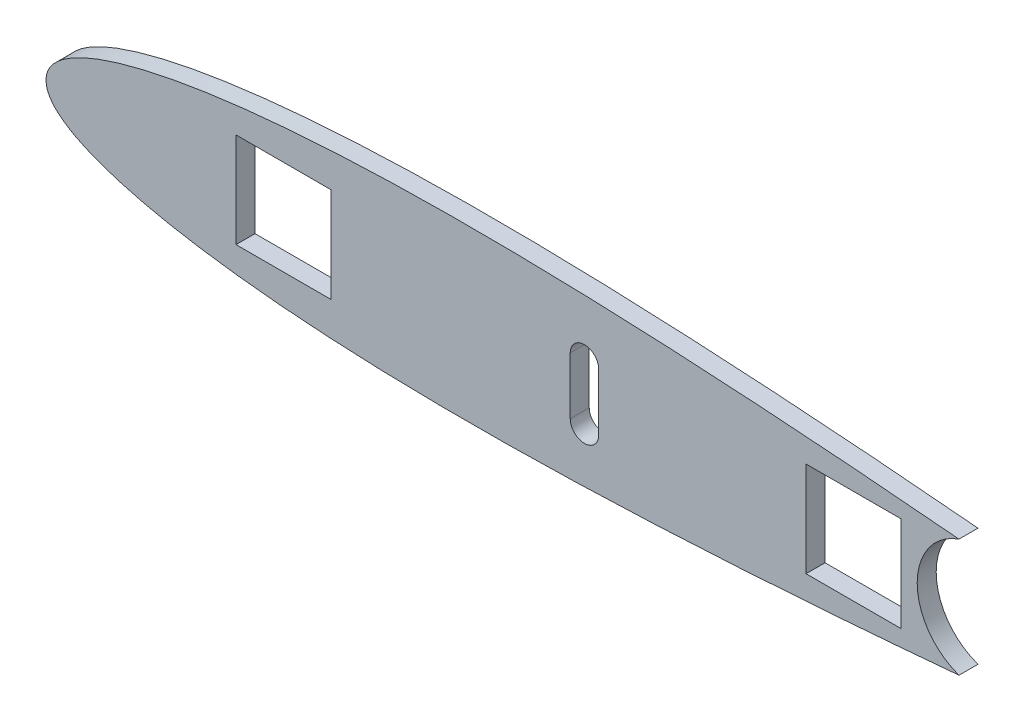
ISO-10303-21;
HEADER;
FILE_DESCRIPTION(('STEP AP214'),'2;1');
FILE_NAME('part.step','',(''),(''),'','','');
FILE_SCHEMA(('AUTOMOTIVE_DESIGN { 1 0 10303 214 1 1 1 1 }'));
ENDSEC;
DATA;
#1=APPLICATION_CONTEXT('core data for automotive mechanical design processes');
#2=APPLICATION_PROTOCOL_DEFINITION('international standard','automotive_design',2000,#1);
#3=PRODUCT_CONTEXT('',#1,'mechanical');
#4=PRODUCT('Part','Part','',(#3));
#5=PRODUCT_RELATED_PRODUCT_CATEGORY('part','',(#4));
#6=PRODUCT_DEFINITION_FORMATION('','',#4);
#7=PRODUCT_DEFINITION_CONTEXT('part definition',#1,'design');
#8=PRODUCT_DEFINITION('design','',#6,#7);
#9=PRODUCT_DEFINITION_SHAPE('','',#8);
#10=(LENGTH_UNIT() NAMED_UNIT(*) SI_UNIT(.MILLI.,.METRE.));
#11=(NAMED_UNIT(*) PLANE_ANGLE_UNIT() SI_UNIT($,.RADIAN.));
#12=(NAMED_UNIT(*) SI_UNIT($,.STERADIAN.) SOLID_ANGLE_UNIT());
#13=UNCERTAINTY_MEASURE_WITH_UNIT(LENGTH_MEASURE(1.E-05),#10,'distance_accuracy_value','');
#14=(GEOMETRIC_REPRESENTATION_CONTEXT(3) GLOBAL_UNCERTAINTY_ASSIGNED_CONTEXT((#13)) GLOBAL_UNIT_ASSIGNED_CONTEXT((#10,
#11,#12)) REPRESENTATION_CONTEXT('',''));
#15=CARTESIAN_POINT('',(0.,0.,0.));
#16=DIRECTION('',(0.,0.,1.));
#17=DIRECTION('',(1.,0.,0.));
#18=AXIS2_PLACEMENT_3D('',#15,#16,#17);
#19=CARTESIAN_POINT('',(98.2727801316517,0.,-0.01));
#20=DIRECTION('',(0.,0.,1.));
#21=DIRECTION('',(1.,0.,0.));
#22=AXIS2_PLACEMENT_3D('',#19,#20,#21);
#23=CYLINDRICAL_SURFACE('',#22,6.57367297916602);
#24=CARTESIAN_POINT('',(98.2727801316517,0.,0.));
#25=DIRECTION('',(0.,0.,-1.));
#26=DIRECTION('',(-1.,0.,0.));
#27=AXIS2_PLACEMENT_3D('',#24,#25,#26);
#28=CIRCLE('',#27,6.57367297916602);
#29=CARTESIAN_POINT('',(96.0984421911493,-6.20366270500869,0.));
#30=VERTEX_POINT('',#29);
#31=CARTESIAN_POINT('',(96.0984421911492,6.20366270500862,0.));
#32=VERTEX_POINT('',#31);
#33=EDGE_CURVE('E369',#30,#32,#28,.T.);
#34=ORIENTED_EDGE('',*,*,#33,.T.);
#35=DIRECTION('',(0.,0.,1.));
#36=VECTOR('',#35,1.);
#37=CARTESIAN_POINT('',(96.0984421911504,6.20366270500853,-0.01));
#38=LINE('',#37,#36);
#39=CARTESIAN_POINT('',(96.0984421911498,6.20366270500858,2.));
#40=VERTEX_POINT('',#39);
#41=EDGE_CURVE('E11',#32,#40,#38,.T.);
#42=ORIENTED_EDGE('',*,*,#41,.T.);
#43=CARTESIAN_POINT('',(98.2727801316517,0.,2.));
#44=DIRECTION('',(0.,0.,-1.));
#45=DIRECTION('',(-1.,0.,0.));
#46=AXIS2_PLACEMENT_3D('',#43,#44,#45);
#47=CIRCLE('',#46,6.57367297916602);
#48=CARTESIAN_POINT('',(96.0984421911499,-6.20366270500863,2.));
#49=VERTEX_POINT('',#48);
#50=EDGE_CURVE('E63',#49,#40,#47,.T.);
#51=ORIENTED_EDGE('',*,*,#50,.F.);
#52=DIRECTION('',(0.,0.,1.));
#53=VECTOR('',#52,1.);
#54=CARTESIAN_POINT('',(96.0984421911505,-6.20366270500858,-0.01));
#55=LINE('',#54,#53);
#56=EDGE_CURVE('E49',#49,#30,#55,.F.);
#57=ORIENTED_EDGE('',*,*,#56,.T.);
#58=EDGE_LOOP('',(#34,#42,#51,#57));
#59=FACE_BOUND('',#58,.T.);
#60=ADVANCED_FACE('F39',(#59),#23,.F.);
#61=CARTESIAN_POINT('',(150.,0.,2.));
#62=CARTESIAN_POINT('',(149.970810303824,0.00413247027790093,2.));
#63=CARTESIAN_POINT('',(149.505193272768,0.0700512290801424,2.));
#64=CARTESIAN_POINT('',(145.420848795191,0.644801769861765,2.));
#65=CARTESIAN_POINT('',(136.579140490007,1.82819578053143,2.));
#66=CARTESIAN_POINT('',(123.127907022393,3.46129711721265,2.));
#67=CARTESIAN_POINT('',(108.784193237312,5.01561269216374,2.));
#68=CARTESIAN_POINT('',(94.4750896656351,6.38138479152888,2.));
#69=CARTESIAN_POINT('',(80.384127490716,7.52487589483772,2.));
#70=CARTESIAN_POINT('',(67.2471798380362,8.34657326807912,2.));
#71=CARTESIAN_POINT('',(55.4492469291881,8.82398055942761,2.));
#72=CARTESIAN_POINT('',(45.268552865917,8.99448588106023,2.));
#73=CARTESIAN_POINT('',(36.6534461757634,8.88420481359412,2.));
#74=CARTESIAN_POINT('',(29.6103003795524,8.57335056911259,2.));
#75=CARTESIAN_POINT('',(24.0847382425465,8.16948510481198,2.));
#76=CARTESIAN_POINT('',(19.0332651731446,7.62778010369845,2.));
#77=CARTESIAN_POINT('',(14.502446862639,6.95545406859103,2.));
#78=CARTESIAN_POINT('',(11.0808665026298,6.27289235058471,2.));
#79=CARTESIAN_POINT('',(8.64096444597624,5.65840604873655,2.));
#80=CARTESIAN_POINT('',(7.03317259205418,5.18878374333255,2.));
#81=CARTESIAN_POINT('',(5.58341356907537,4.6951394099258,2.));
#82=CARTESIAN_POINT('',(4.29476246222922,4.17912910418133,2.));
#83=CARTESIAN_POINT('',(3.16984033745883,3.64229027011625,2.));
#84=CARTESIAN_POINT('',(2.21044072610041,3.085840760044,2.));
#85=CARTESIAN_POINT('',(1.41859373850265,2.51041162089755,2.));
#86=CARTESIAN_POINT('',(0.79351833530711,1.91545308538195,2.));
#87=CARTESIAN_POINT('',(0.343214491645345,1.29886256852423,2.));
#88=CARTESIAN_POINT('',(0.0541247272767373,0.657978530820046,2.));
#89=CARTESIAN_POINT('',(0.0177376787991794,0.215631790194129,2.));
#90=CARTESIAN_POINT('',(0.,0.,2.));
#91=B_SPLINE_CURVE_WITH_KNOTS('',3,(#61,#62,#63,#64,#65,#66,#67,#68,#69,#70,#71,#72,#73,#74,#75,
#76,#77,#78,#79,#80,#81,#82,#83,#84,#85,#86,#87,#88,#89,#90),.UNSPECIFIED.,.F.,.F.,(4,1,1,1,1,1,
1,1,1,1,1,1,1,1,1,1,1,1,1,1,1,1,1,1,1,1,1,4),(0.,0.000578292024416172,0.00922457753142214,
0.0809074610448807,0.175560184178891,0.275014621448024,0.363913352303674,0.457515973042139,
0.552321462271905,0.622093917460096,0.689118854407299,0.752035265470937,0.791075641535419,
0.827397593084318,0.860698922249128,0.890714332661563,0.917222970830825,0.929108018611283,
0.940059875071259,0.950070168420696,0.95913835717605,0.967273831549158,0.974500443960092,
0.980862985696458,0.986437693887403,0.991348140987964,0.995782458248403,1.),.UNSPECIFIED.);
#92=DIRECTION('',(0.,0.,-1.));
#93=VECTOR('',#92,1.);
#94=SURFACE_OF_LINEAR_EXTRUSION('',#91,#93);
#95=ORIENTED_EDGE('',*,*,#41,.F.);
#96=CARTESIAN_POINT('',(150.,0.,0.));
#97=CARTESIAN_POINT('',(149.970810303824,0.00413247027790093,0.));
#98=CARTESIAN_POINT('',(149.505193272768,0.0700512290801424,0.));
#99=CARTESIAN_POINT('',(145.420848795191,0.644801769861765,0.));
#100=CARTESIAN_POINT('',(136.579140490007,1.82819578053143,0.));
#101=CARTESIAN_POINT('',(123.127907022393,3.46129711721265,0.));
#102=CARTESIAN_POINT('',(108.784193237312,5.01561269216374,0.));
#103=CARTESIAN_POINT('',(94.4750896656351,6.38138479152888,0.));
#104=CARTESIAN_POINT('',(80.384127490716,7.52487589483772,0.));
#105=CARTESIAN_POINT('',(67.2471798380362,8.34657326807912,0.));
#106=CARTESIAN_POINT('',(55.4492469291881,8.82398055942761,0.));
#107=CARTESIAN_POINT('',(45.268552865917,8.99448588106023,0.));
#108=CARTESIAN_POINT('',(36.6534461757634,8.88420481359412,0.));
#109=CARTESIAN_POINT('',(29.6103003795524,8.57335056911259,0.));
#110=CARTESIAN_POINT('',(24.0847382425465,8.16948510481198,0.));
#111=CARTESIAN_POINT('',(19.0332651731446,7.62778010369845,0.));
#112=CARTESIAN_POINT('',(14.502446862639,6.95545406859103,0.));
#113=CARTESIAN_POINT('',(11.0808665026298,6.27289235058471,0.));
#114=CARTESIAN_POINT('',(8.64096444597624,5.65840604873655,0.));
#115=CARTESIAN_POINT('',(7.03317259205418,5.18878374333255,0.));
#116=CARTESIAN_POINT('',(5.58341356907537,4.6951394099258,0.));
#117=CARTESIAN_POINT('',(4.29476246222922,4.17912910418133,0.));
#118=CARTESIAN_POINT('',(3.16984033745883,3.64229027011625,0.));
#119=CARTESIAN_POINT('',(2.21044072610041,3.085840760044,0.));
#120=CARTESIAN_POINT('',(1.41859373850265,2.51041162089755,0.));
#121=CARTESIAN_POINT('',(0.79351833530711,1.91545308538195,0.));
#122=CARTESIAN_POINT('',(0.343214491645345,1.29886256852423,0.));
#123=CARTESIAN_POINT('',(0.0541247272767373,0.657978530820046,0.));
#124=CARTESIAN_POINT('',(0.0177376787991794,0.215631790194129,0.));
#125=CARTESIAN_POINT('',(0.,0.,0.));
#126=B_SPLINE_CURVE_WITH_KNOTS('',3,(#96,#97,#98,#99,#100,#101,#102,#103,#104,#105,#106,#107,
#108,#109,#110,#111,#112,#113,#114,#115,#116,#117,#118,#119,#120,#121,#122,#123,#124,#125),
.UNSPECIFIED.,.F.,.F.,(4,1,1,1,1,1,1,1,1,1,1,1,1,1,1,1,1,1,1,1,1,1,1,1,1,1,1,4),(0.,
0.000578292024416172,0.00922457753142214,0.0809074610448807,0.175560184178891,0.275014621448024,
0.363913352303674,0.457515973042139,0.552321462271905,0.622093917460096,0.689118854407299,
0.752035265470937,0.791075641535419,0.827397593084318,0.860698922249128,0.890714332661563,
0.917222970830825,0.929108018611283,0.940059875071259,0.950070168420696,0.95913835717605,
0.967273831549158,0.974500443960092,0.980862985696458,0.986437693887403,0.991348140987964,
0.995782458248403,1.),.UNSPECIFIED.);
#127=CARTESIAN_POINT('',(0.,0.,0.));
#128=VERTEX_POINT('',#127);
#129=EDGE_CURVE('E298',#32,#128,#126,.T.);
#130=ORIENTED_EDGE('',*,*,#129,.T.);
#131=DIRECTION('',(0.,0.,-1.));
#132=VECTOR('',#131,1.);
#133=CARTESIAN_POINT('',(0.,0.,2.));
#134=LINE('',#133,#132);
#135=CARTESIAN_POINT('',(0.,0.,2.));
#136=VERTEX_POINT('',#135);
#137=EDGE_CURVE('E382',#136,#128,#134,.T.);
#138=ORIENTED_EDGE('',*,*,#137,.F.);
#139=EDGE_CURVE('E297',#40,#136,#91,.T.);
#140=ORIENTED_EDGE('',*,*,#139,.F.);
#141=EDGE_LOOP('',(#95,#130,#138,#140));
#142=FACE_BOUND('',#141,.T.);
#143=ADVANCED_FACE('F309',(#142),#94,.F.);
#144=CARTESIAN_POINT('',(0.,0.,2.));
#145=CARTESIAN_POINT('',(0.0177376787991794,-0.215631790194129,2.));
#146=CARTESIAN_POINT('',(0.0541247272767369,-0.657978530820046,2.));
#147=CARTESIAN_POINT('',(0.343214491645348,-1.29886256852425,2.));
#148=CARTESIAN_POINT('',(0.793518335307111,-1.91545308538195,2.));
#149=CARTESIAN_POINT('',(1.41859373850264,-2.51041162089754,2.));
#150=CARTESIAN_POINT('',(2.21044072610041,-3.085840760044,2.));
#151=CARTESIAN_POINT('',(3.16984033745882,-3.64229027011627,2.));
#152=CARTESIAN_POINT('',(4.29476246222924,-4.17912910418133,2.));
#153=CARTESIAN_POINT('',(5.58341356907541,-4.6951394099258,2.));
#154=CARTESIAN_POINT('',(7.03317259205414,-5.18878374333255,2.));
#155=CARTESIAN_POINT('',(8.64096444597628,-5.65840604873651,2.));
#156=CARTESIAN_POINT('',(11.0808665026297,-6.27289235058471,2.));
#157=CARTESIAN_POINT('',(14.5024468626391,-6.95545406859103,2.));
#158=CARTESIAN_POINT('',(19.0332651731447,-7.62778010369857,2.));
#159=CARTESIAN_POINT('',(24.0847382425464,-8.16948510481198,2.));
#160=CARTESIAN_POINT('',(29.6103003795524,-8.57335056911259,2.));
#161=CARTESIAN_POINT('',(36.6534461757636,-8.88420481359409,2.));
#162=CARTESIAN_POINT('',(45.2685528659167,-8.99448588106023,2.));
#163=CARTESIAN_POINT('',(55.4492469291882,-8.82398055942765,2.));
#164=CARTESIAN_POINT('',(67.2471798380359,-8.34657326807916,2.));
#165=CARTESIAN_POINT('',(80.3841274907154,-7.52487589483776,2.));
#166=CARTESIAN_POINT('',(94.4750896656351,-6.38138479152894,2.));
#167=CARTESIAN_POINT('',(108.784193237314,-5.01561269216372,2.));
#168=CARTESIAN_POINT('',(123.127907022394,-3.46129711721264,2.));
#169=CARTESIAN_POINT('',(136.579140490007,-1.82819578053142,2.));
#170=CARTESIAN_POINT('',(145.420848795191,-0.644801769861778,2.));
#171=CARTESIAN_POINT('',(149.505193272768,-0.0700512290801454,2.));
#172=CARTESIAN_POINT('',(149.970810303824,-0.00413247027789827,2.));
#173=CARTESIAN_POINT('',(150.,0.,2.));
#174=B_SPLINE_CURVE_WITH_KNOTS('',3,(#144,#145,#146,#147,#148,#149,#150,#151,#152,#153,#154,
#155,#156,#157,#158,#159,#160,#161,#162,#163,#164,#165,#166,#167,#168,#169,#170,#171,#172,#173),
.UNSPECIFIED.,.F.,.F.,(4,1,1,1,1,1,1,1,1,1,1,1,1,1,1,1,1,1,1,1,1,1,1,1,1,1,1,4),(0.,
0.00421754175159676,0.00865185901203598,0.013562306112597,0.0191370143035422,0.0254995560399083,
0.0327261684508418,0.0408616428239496,0.049929831579304,0.0599401249287409,0.0708919813887169,
0.082777029169175,0.109285667338437,0.139301077750872,0.172602406915682,0.208924358464581,
0.247964734529063,0.310881145592701,0.377906082539904,0.447678537728095,0.542484026957861,
0.636086647696326,0.724985378551976,0.824439815821109,0.919092538955119,0.990775422468578,
0.999421707975584,1.),.UNSPECIFIED.);
#175=DIRECTION('',(0.,0.,-1.));
#176=VECTOR('',#175,1.);
#177=SURFACE_OF_LINEAR_EXTRUSION('',#174,#176);
#178=ORIENTED_EDGE('',*,*,#56,.F.);
#179=EDGE_CURVE('E291',#136,#49,#174,.T.);
#180=ORIENTED_EDGE('',*,*,#179,.F.);
#181=ORIENTED_EDGE('',*,*,#137,.T.);
#182=CARTESIAN_POINT('',(0.,0.,0.));
#183=CARTESIAN_POINT('',(0.0177376787991794,-0.215631790194129,0.));
#184=CARTESIAN_POINT('',(0.0541247272767369,-0.657978530820046,0.));
#185=CARTESIAN_POINT('',(0.343214491645348,-1.29886256852425,0.));
#186=CARTESIAN_POINT('',(0.793518335307111,-1.91545308538195,0.));
#187=CARTESIAN_POINT('',(1.41859373850264,-2.51041162089754,0.));
#188=CARTESIAN_POINT('',(2.21044072610041,-3.085840760044,0.));
#189=CARTESIAN_POINT('',(3.16984033745882,-3.64229027011627,0.));
#190=CARTESIAN_POINT('',(4.29476246222924,-4.17912910418133,0.));
#191=CARTESIAN_POINT('',(5.58341356907541,-4.6951394099258,0.));
#192=CARTESIAN_POINT('',(7.03317259205414,-5.18878374333255,0.));
#193=CARTESIAN_POINT('',(8.64096444597628,-5.65840604873651,0.));
#194=CARTESIAN_POINT('',(11.0808665026297,-6.27289235058471,0.));
#195=CARTESIAN_POINT('',(14.5024468626391,-6.95545406859103,0.));
#196=CARTESIAN_POINT('',(19.0332651731447,-7.62778010369857,0.));
#197=CARTESIAN_POINT('',(24.0847382425464,-8.16948510481198,0.));
#198=CARTESIAN_POINT('',(29.6103003795524,-8.57335056911259,0.));
#199=CARTESIAN_POINT('',(36.6534461757636,-8.88420481359409,0.));
#200=CARTESIAN_POINT('',(45.2685528659167,-8.99448588106023,0.));
#201=CARTESIAN_POINT('',(55.4492469291882,-8.82398055942765,0.));
#202=CARTESIAN_POINT('',(67.2471798380359,-8.34657326807916,0.));
#203=CARTESIAN_POINT('',(80.3841274907154,-7.52487589483776,0.));
#204=CARTESIAN_POINT('',(94.4750896656351,-6.38138479152894,0.));
#205=CARTESIAN_POINT('',(108.784193237314,-5.01561269216372,0.));
#206=CARTESIAN_POINT('',(123.127907022394,-3.46129711721264,0.));
#207=CARTESIAN_POINT('',(136.579140490007,-1.82819578053142,0.));
#208=CARTESIAN_POINT('',(145.420848795191,-0.644801769861778,0.));
#209=CARTESIAN_POINT('',(149.505193272768,-0.0700512290801454,0.));
#210=CARTESIAN_POINT('',(149.970810303824,-0.00413247027789827,0.));
#211=CARTESIAN_POINT('',(150.,0.,0.));
#212=B_SPLINE_CURVE_WITH_KNOTS('',3,(#182,#183,#184,#185,#186,#187,#188,#189,#190,#191,#192,
#193,#194,#195,#196,#197,#198,#199,#200,#201,#202,#203,#204,#205,#206,#207,#208,#209,#210,#211),
.UNSPECIFIED.,.F.,.F.,(4,1,1,1,1,1,1,1,1,1,1,1,1,1,1,1,1,1,1,1,1,1,1,1,1,1,1,4),(0.,
0.00421754175159676,0.00865185901203598,0.013562306112597,0.0191370143035422,0.0254995560399083,
0.0327261684508418,0.0408616428239496,0.049929831579304,0.0599401249287409,0.0708919813887169,
0.082777029169175,0.109285667338437,0.139301077750872,0.172602406915682,0.208924358464581,
0.247964734529063,0.310881145592701,0.377906082539904,0.447678537728095,0.542484026957861,
0.636086647696326,0.724985378551976,0.824439815821109,0.919092538955119,0.990775422468578,
0.999421707975584,1.),.UNSPECIFIED.);
#213=EDGE_CURVE('E42',#128,#30,#212,.T.);
#214=ORIENTED_EDGE('',*,*,#213,.T.);
#215=EDGE_LOOP('',(#178,#180,#181,#214));
#216=FACE_BOUND('',#215,.T.);
#217=ADVANCED_FACE('F305',(#216),#177,.F.);
#218=CARTESIAN_POINT('',(73.959377623778,-7.91362684741891,2.));
#219=DIRECTION('',(0.,0.,-1.));
#220=DIRECTION('',(-1.,0.,0.));
#221=AXIS2_PLACEMENT_3D('',#218,#219,#220);
#222=PLANE('',#221);
#223=DIRECTION('',(0.,1.,0.));
#224=VECTOR('',#223,1.);
#225=CARTESIAN_POINT('',(58.1780561277094,-3.27924130211344,2.));
#226=LINE('',#225,#224);
#227=CARTESIAN_POINT('',(58.1780561277094,-3.27924130211344,2.));
#228=VERTEX_POINT('',#227);
#229=CARTESIAN_POINT('',(58.1780561277094,2.72116263132885,2.));
#230=VERTEX_POINT('',#229);
#231=EDGE_CURVE('E189',#228,#230,#226,.T.);
#232=ORIENTED_EDGE('',*,*,#231,.F.);
#233=CARTESIAN_POINT('',(56.6779551443489,-3.27924130211344,2.));
#234=DIRECTION('',(0.,0.,1.));
#235=DIRECTION('',(1.,0.,0.));
#236=AXIS2_PLACEMENT_3D('',#233,#234,#235);
#237=CIRCLE('',#236,1.50010098336057);
#238=CARTESIAN_POINT('',(55.1778541609883,-3.27924130211344,2.));
#239=VERTEX_POINT('',#238);
#240=EDGE_CURVE('E155',#239,#228,#237,.T.);
#241=ORIENTED_EDGE('',*,*,#240,.F.);
#242=DIRECTION('',(0.,-1.,0.));
#243=VECTOR('',#242,1.);
#244=CARTESIAN_POINT('',(55.1778541609883,-3.27924130211344,2.));
#245=LINE('',#244,#243);
#246=CARTESIAN_POINT('',(55.1778541609883,2.72116263132885,2.));
#247=VERTEX_POINT('',#246);
#248=EDGE_CURVE('E176',#247,#239,#245,.T.);
#249=ORIENTED_EDGE('',*,*,#248,.F.);
#250=CARTESIAN_POINT('',(56.6779551443489,2.72116263132885,2.));
#251=DIRECTION('',(0.,0.,1.));
#252=DIRECTION('',(1.,0.,0.));
#253=AXIS2_PLACEMENT_3D('',#250,#251,#252);
#254=CIRCLE('',#253,1.50010098336057);
#255=EDGE_CURVE('E180',#230,#247,#254,.T.);
#256=ORIENTED_EDGE('',*,*,#255,.F.);
#257=EDGE_LOOP('',(#232,#241,#249,#256));
#258=FACE_BOUND('',#257,.T.);
#259=DIRECTION('',(1.,0.,0.));
#260=VECTOR('',#259,1.);
#261=CARTESIAN_POINT('',(20.,5.,2.));
#262=LINE('',#261,#260);
#263=CARTESIAN_POINT('',(20.,5.,2.));
#264=VERTEX_POINT('',#263);
#265=CARTESIAN_POINT('',(30.,5.,2.));
#266=VERTEX_POINT('',#265);
#267=EDGE_CURVE('E225',#264,#266,#262,.T.);
#268=ORIENTED_EDGE('',*,*,#267,.T.);
#269=DIRECTION('',(0.,-1.,0.));
#270=VECTOR('',#269,1.);
#271=CARTESIAN_POINT('',(30.,5.,2.));
#272=LINE('',#271,#270);
#273=CARTESIAN_POINT('',(30.,-5.,2.));
#274=VERTEX_POINT('',#273);
#275=EDGE_CURVE('E272',#266,#274,#272,.T.);
#276=ORIENTED_EDGE('',*,*,#275,.T.);
#277=DIRECTION('',(1.,0.,0.));
#278=VECTOR('',#277,1.);
#279=CARTESIAN_POINT('',(20.,-5.,2.));
#280=LINE('',#279,#278);
#281=CARTESIAN_POINT('',(20.,-5.,2.));
#282=VERTEX_POINT('',#281);
#283=EDGE_CURVE('E267',#282,#274,#280,.T.);
#284=ORIENTED_EDGE('',*,*,#283,.F.);
#285=DIRECTION('',(0.,-1.,0.));
#286=VECTOR('',#285,1.);
#287=CARTESIAN_POINT('',(20.,5.,2.));
#288=LINE('',#287,#286);
#289=EDGE_CURVE('E263',#264,#282,#288,.T.);
#290=ORIENTED_EDGE('',*,*,#289,.F.);
#291=EDGE_LOOP('',(#268,#276,#284,#290));
#292=FACE_BOUND('',#291,.T.);
#293=ORIENTED_EDGE('',*,*,#179,.T.);
#294=ORIENTED_EDGE('',*,*,#50,.T.);
#295=ORIENTED_EDGE('',*,*,#139,.T.);
#296=EDGE_LOOP('',(#293,#294,#295));
#297=FACE_BOUND('',#296,.T.);
#298=DIRECTION('',(1.,0.,0.));
#299=VECTOR('',#298,1.);
#300=CARTESIAN_POINT('',(80.,5.,2.));
#301=LINE('',#300,#299);
#302=CARTESIAN_POINT('',(80.,5.,2.));
#303=VERTEX_POINT('',#302);
#304=CARTESIAN_POINT('',(90.,5.,2.));
#305=VERTEX_POINT('',#304);
#306=EDGE_CURVE('E220',#303,#305,#301,.T.);
#307=ORIENTED_EDGE('',*,*,#306,.T.);
#308=DIRECTION('',(0.,-1.,0.));
#309=VECTOR('',#308,1.);
#310=CARTESIAN_POINT('',(90.,5.,2.));
#311=LINE('',#310,#309);
#312=CARTESIAN_POINT('',(90.,-4.99999999999999,2.));
#313=VERTEX_POINT('',#312);
#314=EDGE_CURVE('E224',#305,#313,#311,.T.);
#315=ORIENTED_EDGE('',*,*,#314,.T.);
#316=DIRECTION('',(1.,0.,0.));
#317=VECTOR('',#316,1.);
#318=CARTESIAN_POINT('',(80.,-4.99999999999999,2.));
#319=LINE('',#318,#317);
#320=CARTESIAN_POINT('',(80.,-4.99999999999999,2.));
#321=VERTEX_POINT('',#320);
#322=EDGE_CURVE('E229',#321,#313,#319,.T.);
#323=ORIENTED_EDGE('',*,*,#322,.F.);
#324=DIRECTION('',(0.,-1.,0.));
#325=VECTOR('',#324,1.);
#326=CARTESIAN_POINT('',(80.,5.,2.));
#327=LINE('',#326,#325);
#328=EDGE_CURVE('E208',#303,#321,#327,.T.);
#329=ORIENTED_EDGE('',*,*,#328,.F.);
#330=EDGE_LOOP('',(#307,#315,#323,#329));
#331=FACE_BOUND('',#330,.T.);
#332=ADVANCED_FACE('F308',(#258,#292,#297,#331),#222,.F.);
#333=CARTESIAN_POINT('',(73.959377623778,-7.91362684741891,0.));
#334=DIRECTION('',(0.,0.,-1.));
#335=DIRECTION('',(-1.,0.,0.));
#336=AXIS2_PLACEMENT_3D('',#333,#334,#335);
#337=PLANE('',#336);
#338=ORIENTED_EDGE('',*,*,#33,.F.);
#339=ORIENTED_EDGE('',*,*,#213,.F.);
#340=ORIENTED_EDGE('',*,*,#129,.F.);
#341=EDGE_LOOP('',(#338,#339,#340));
#342=FACE_BOUND('',#341,.T.);
#343=CARTESIAN_POINT('',(56.6779551443489,-3.27924130211344,0.));
#344=DIRECTION('',(0.,0.,1.));
#345=DIRECTION('',(1.,0.,0.));
#346=AXIS2_PLACEMENT_3D('',#343,#344,#345);
#347=CIRCLE('',#346,1.50010098336057);
#348=CARTESIAN_POINT('',(55.1778541609883,-3.27924130211344,0.));
#349=VERTEX_POINT('',#348);
#350=CARTESIAN_POINT('',(58.1780561277094,-3.27924130211344,0.));
#351=VERTEX_POINT('',#350);
#352=EDGE_CURVE('E152',#349,#351,#347,.T.);
#353=ORIENTED_EDGE('',*,*,#352,.T.);
#354=DIRECTION('',(0.,1.,0.));
#355=VECTOR('',#354,1.);
#356=CARTESIAN_POINT('',(58.1780561277094,-3.27924130211344,0.));
#357=LINE('',#356,#355);
#358=CARTESIAN_POINT('',(58.1780561277094,2.72116263132885,0.));
#359=VERTEX_POINT('',#358);
#360=EDGE_CURVE('E165',#351,#359,#357,.T.);
#361=ORIENTED_EDGE('',*,*,#360,.T.);
#362=CARTESIAN_POINT('',(56.6779551443489,2.72116263132885,0.));
#363=DIRECTION('',(0.,0.,1.));
#364=DIRECTION('',(1.,0.,0.));
#365=AXIS2_PLACEMENT_3D('',#362,#363,#364);
#366=CIRCLE('',#365,1.50010098336057);
#367=CARTESIAN_POINT('',(55.1778541609883,2.72116263132885,0.));
#368=VERTEX_POINT('',#367);
#369=EDGE_CURVE('E170',#359,#368,#366,.T.);
#370=ORIENTED_EDGE('',*,*,#369,.T.);
#371=DIRECTION('',(0.,-1.,0.));
#372=VECTOR('',#371,1.);
#373=CARTESIAN_POINT('',(55.1778541609883,-3.27924130211344,0.));
#374=LINE('',#373,#372);
#375=EDGE_CURVE('E161',#368,#349,#374,.T.);
#376=ORIENTED_EDGE('',*,*,#375,.T.);
#377=EDGE_LOOP('',(#353,#361,#370,#376));
#378=FACE_BOUND('',#377,.T.);
#379=DIRECTION('',(0.,-1.,0.));
#380=VECTOR('',#379,1.);
#381=CARTESIAN_POINT('',(30.,5.,0.));
#382=LINE('',#381,#380);
#383=CARTESIAN_POINT('',(30.,5.,0.));
#384=VERTEX_POINT('',#383);
#385=CARTESIAN_POINT('',(30.,-5.,0.));
#386=VERTEX_POINT('',#385);
#387=EDGE_CURVE('E286',#384,#386,#382,.T.);
#388=ORIENTED_EDGE('',*,*,#387,.F.);
#389=DIRECTION('',(1.,0.,0.));
#390=VECTOR('',#389,1.);
#391=CARTESIAN_POINT('',(20.,5.,0.));
#392=LINE('',#391,#390);
#393=CARTESIAN_POINT('',(20.,5.,0.));
#394=VERTEX_POINT('',#393);
#395=EDGE_CURVE('E268',#394,#384,#392,.T.);
#396=ORIENTED_EDGE('',*,*,#395,.F.);
#397=DIRECTION('',(0.,-1.,0.));
#398=VECTOR('',#397,1.);
#399=CARTESIAN_POINT('',(20.,5.,0.));
#400=LINE('',#399,#398);
#401=CARTESIAN_POINT('',(20.,-5.,0.));
#402=VERTEX_POINT('',#401);
#403=EDGE_CURVE('E262',#394,#402,#400,.T.);
#404=ORIENTED_EDGE('',*,*,#403,.T.);
#405=DIRECTION('',(1.,0.,0.));
#406=VECTOR('',#405,1.);
#407=CARTESIAN_POINT('',(20.,-5.,0.));
#408=LINE('',#407,#406);
#409=EDGE_CURVE('E282',#402,#386,#408,.T.);
#410=ORIENTED_EDGE('',*,*,#409,.T.);
#411=EDGE_LOOP('',(#388,#396,#404,#410));
#412=FACE_BOUND('',#411,.T.);
#413=DIRECTION('',(0.,-1.,0.));
#414=VECTOR('',#413,1.);
#415=CARTESIAN_POINT('',(90.,5.,0.));
#416=LINE('',#415,#414);
#417=CARTESIAN_POINT('',(90.,5.,0.));
#418=VERTEX_POINT('',#417);
#419=CARTESIAN_POINT('',(90.,-4.99999999999999,0.));
#420=VERTEX_POINT('',#419);
#421=EDGE_CURVE('E207',#418,#420,#416,.T.);
#422=ORIENTED_EDGE('',*,*,#421,.F.);
#423=DIRECTION('',(1.,0.,0.));
#424=VECTOR('',#423,1.);
#425=CARTESIAN_POINT('',(80.,5.,0.));
#426=LINE('',#425,#424);
#427=CARTESIAN_POINT('',(80.,5.,0.));
#428=VERTEX_POINT('',#427);
#429=EDGE_CURVE('E204',#428,#418,#426,.T.);
#430=ORIENTED_EDGE('',*,*,#429,.F.);
#431=DIRECTION('',(0.,-1.,0.));
#432=VECTOR('',#431,1.);
#433=CARTESIAN_POINT('',(80.,5.,0.));
#434=LINE('',#433,#432);
#435=CARTESIAN_POINT('',(80.,-4.99999999999999,0.));
#436=VERTEX_POINT('',#435);
#437=EDGE_CURVE('E215',#428,#436,#434,.T.);
#438=ORIENTED_EDGE('',*,*,#437,.T.);
#439=DIRECTION('',(1.,0.,0.));
#440=VECTOR('',#439,1.);
#441=CARTESIAN_POINT('',(80.,-4.99999999999999,0.));
#442=LINE('',#441,#440);
#443=EDGE_CURVE('E211',#436,#420,#442,.T.);
#444=ORIENTED_EDGE('',*,*,#443,.T.);
#445=EDGE_LOOP('',(#422,#430,#438,#444));
#446=FACE_BOUND('',#445,.T.);
#447=ADVANCED_FACE('F172',(#342,#378,#412,#446),#337,.T.);
#448=CARTESIAN_POINT('',(20.,5.,0.));
#449=DIRECTION('',(0.,-1.,0.));
#450=DIRECTION('',(0.,0.,-1.));
#451=AXIS2_PLACEMENT_3D('',#448,#449,#450);
#452=PLANE('',#451);
#453=ORIENTED_EDGE('',*,*,#267,.F.);
#454=DIRECTION('',(0.,0.,1.));
#455=VECTOR('',#454,1.);
#456=CARTESIAN_POINT('',(20.,5.,0.));
#457=LINE('',#456,#455);
#458=EDGE_CURVE('E258',#394,#264,#457,.T.);
#459=ORIENTED_EDGE('',*,*,#458,.F.);
#460=ORIENTED_EDGE('',*,*,#395,.T.);
#461=DIRECTION('',(0.,0.,1.));
#462=VECTOR('',#461,1.);
#463=CARTESIAN_POINT('',(30.,5.,0.));
#464=LINE('',#463,#462);
#465=EDGE_CURVE('E198',#384,#266,#464,.T.);
#466=ORIENTED_EDGE('',*,*,#465,.T.);
#467=EDGE_LOOP('',(#453,#459,#460,#466));
#468=FACE_BOUND('',#467,.T.);
#469=ADVANCED_FACE('F315',(#468),#452,.T.);
#470=CARTESIAN_POINT('',(30.,5.,0.));
#471=DIRECTION('',(-1.,0.,0.));
#472=DIRECTION('',(0.,0.,1.));
#473=AXIS2_PLACEMENT_3D('',#470,#471,#472);
#474=PLANE('',#473);
#475=ORIENTED_EDGE('',*,*,#275,.F.);
#476=ORIENTED_EDGE('',*,*,#465,.F.);
#477=ORIENTED_EDGE('',*,*,#387,.T.);
#478=DIRECTION('',(0.,0.,1.));
#479=VECTOR('',#478,1.);
#480=CARTESIAN_POINT('',(30.,-5.,0.));
#481=LINE('',#480,#479);
#482=EDGE_CURVE('E252',#386,#274,#481,.T.);
#483=ORIENTED_EDGE('',*,*,#482,.T.);
#484=EDGE_LOOP('',(#475,#476,#477,#483));
#485=FACE_BOUND('',#484,.T.);
#486=ADVANCED_FACE('F328',(#485),#474,.T.);
#487=CARTESIAN_POINT('',(20.,-5.,0.));
#488=DIRECTION('',(0.,-1.,0.));
#489=DIRECTION('',(1.,0.,0.));
#490=AXIS2_PLACEMENT_3D('',#487,#488,#489);
#491=PLANE('',#490);
#492=ORIENTED_EDGE('',*,*,#283,.T.);
#493=ORIENTED_EDGE('',*,*,#482,.F.);
#494=ORIENTED_EDGE('',*,*,#409,.F.);
#495=DIRECTION('',(0.,0.,1.));
#496=VECTOR('',#495,1.);
#497=CARTESIAN_POINT('',(20.,-5.,0.));
#498=LINE('',#497,#496);
#499=EDGE_CURVE('E255',#402,#282,#498,.T.);
#500=ORIENTED_EDGE('',*,*,#499,.T.);
#501=EDGE_LOOP('',(#492,#493,#494,#500));
#502=FACE_BOUND('',#501,.T.);
#503=ADVANCED_FACE('F324',(#502),#491,.F.);
#504=CARTESIAN_POINT('',(20.,5.,0.));
#505=DIRECTION('',(-1.,0.,0.));
#506=DIRECTION('',(0.,0.,1.));
#507=AXIS2_PLACEMENT_3D('',#504,#505,#506);
#508=PLANE('',#507);
#509=ORIENTED_EDGE('',*,*,#289,.T.);
#510=ORIENTED_EDGE('',*,*,#499,.F.);
#511=ORIENTED_EDGE('',*,*,#403,.F.);
#512=ORIENTED_EDGE('',*,*,#458,.T.);
#513=EDGE_LOOP('',(#509,#510,#511,#512));
#514=FACE_BOUND('',#513,.T.);
#515=ADVANCED_FACE('F320',(#514),#508,.F.);
#516=CARTESIAN_POINT('',(80.,5.,0.));
#517=DIRECTION('',(0.,-1.,0.));
#518=DIRECTION('',(0.,0.,-1.));
#519=AXIS2_PLACEMENT_3D('',#516,#517,#518);
#520=PLANE('',#519);
#521=ORIENTED_EDGE('',*,*,#306,.F.);
#522=DIRECTION('',(0.,0.,1.));
#523=VECTOR('',#522,1.);
#524=CARTESIAN_POINT('',(80.,5.,0.));
#525=LINE('',#524,#523);
#526=EDGE_CURVE('E219',#428,#303,#525,.T.);
#527=ORIENTED_EDGE('',*,*,#526,.F.);
#528=ORIENTED_EDGE('',*,*,#429,.T.);
#529=DIRECTION('',(0.,0.,1.));
#530=VECTOR('',#529,1.);
#531=CARTESIAN_POINT('',(90.,5.,0.));
#532=LINE('',#531,#530);
#533=EDGE_CURVE('E245',#418,#305,#532,.T.);
#534=ORIENTED_EDGE('',*,*,#533,.T.);
#535=EDGE_LOOP('',(#521,#527,#528,#534));
#536=FACE_BOUND('',#535,.T.);
#537=ADVANCED_FACE('F323',(#536),#520,.T.);
#538=CARTESIAN_POINT('',(90.,5.,0.));
#539=DIRECTION('',(-1.,0.,0.));
#540=DIRECTION('',(0.,0.,1.));
#541=AXIS2_PLACEMENT_3D('',#538,#539,#540);
#542=PLANE('',#541);
#543=ORIENTED_EDGE('',*,*,#314,.F.);
#544=ORIENTED_EDGE('',*,*,#533,.F.);
#545=ORIENTED_EDGE('',*,*,#421,.T.);
#546=DIRECTION('',(0.,0.,1.));
#547=VECTOR('',#546,1.);
#548=CARTESIAN_POINT('',(90.,-4.99999999999999,0.));
#549=LINE('',#548,#547);
#550=EDGE_CURVE('E242',#420,#313,#549,.T.);
#551=ORIENTED_EDGE('',*,*,#550,.T.);
#552=EDGE_LOOP('',(#543,#544,#545,#551));
#553=FACE_BOUND('',#552,.T.);
#554=ADVANCED_FACE('F338',(#553),#542,.T.);
#555=CARTESIAN_POINT('',(80.,-4.99999999999999,0.));
#556=DIRECTION('',(0.,-1.,0.));
#557=DIRECTION('',(0.,0.,-1.));
#558=AXIS2_PLACEMENT_3D('',#555,#556,#557);
#559=PLANE('',#558);
#560=ORIENTED_EDGE('',*,*,#322,.T.);
#561=ORIENTED_EDGE('',*,*,#550,.F.);
#562=ORIENTED_EDGE('',*,*,#443,.F.);
#563=DIRECTION('',(0.,0.,1.));
#564=VECTOR('',#563,1.);
#565=CARTESIAN_POINT('',(80.,-4.99999999999999,0.));
#566=LINE('',#565,#564);
#567=EDGE_CURVE('E239',#436,#321,#566,.T.);
#568=ORIENTED_EDGE('',*,*,#567,.T.);
#569=EDGE_LOOP('',(#560,#561,#562,#568));
#570=FACE_BOUND('',#569,.T.);
#571=ADVANCED_FACE('F342',(#570),#559,.F.);
#572=CARTESIAN_POINT('',(80.,5.,0.));
#573=DIRECTION('',(-1.,0.,0.));
#574=DIRECTION('',(0.,0.,1.));
#575=AXIS2_PLACEMENT_3D('',#572,#573,#574);
#576=PLANE('',#575);
#577=ORIENTED_EDGE('',*,*,#328,.T.);
#578=ORIENTED_EDGE('',*,*,#567,.F.);
#579=ORIENTED_EDGE('',*,*,#437,.F.);
#580=ORIENTED_EDGE('',*,*,#526,.T.);
#581=EDGE_LOOP('',(#577,#578,#579,#580));
#582=FACE_BOUND('',#581,.T.);
#583=ADVANCED_FACE('F346',(#582),#576,.F.);
#584=CARTESIAN_POINT('',(56.6779551443489,-3.27924130211344,0.));
#585=DIRECTION('',(0.,0.,1.));
#586=DIRECTION('',(1.,0.,0.));
#587=AXIS2_PLACEMENT_3D('',#584,#585,#586);
#588=CYLINDRICAL_SURFACE('',#587,1.50010098336057);
#589=ORIENTED_EDGE('',*,*,#240,.T.);
#590=DIRECTION('',(0.,0.,1.));
#591=VECTOR('',#590,1.);
#592=CARTESIAN_POINT('',(58.1780561277094,-3.27924130211344,0.));
#593=LINE('',#592,#591);
#594=EDGE_CURVE('E148',#351,#228,#593,.T.);
#595=ORIENTED_EDGE('',*,*,#594,.F.);
#596=ORIENTED_EDGE('',*,*,#352,.F.);
#597=DIRECTION('',(0.,0.,1.));
#598=VECTOR('',#597,1.);
#599=CARTESIAN_POINT('',(55.1778541609883,-3.27924130211344,0.));
#600=LINE('',#599,#598);
#601=EDGE_CURVE('E195',#349,#239,#600,.T.);
#602=ORIENTED_EDGE('',*,*,#601,.T.);
#603=EDGE_LOOP('',(#589,#595,#596,#602));
#604=FACE_BOUND('',#603,.T.);
#605=ADVANCED_FACE('F150',(#604),#588,.F.);
#606=CARTESIAN_POINT('',(55.1778541609883,-3.27924130211344,0.));
#607=DIRECTION('',(-1.,0.,0.));
#608=DIRECTION('',(0.,0.,1.));
#609=AXIS2_PLACEMENT_3D('',#606,#607,#608);
#610=PLANE('',#609);
#611=ORIENTED_EDGE('',*,*,#248,.T.);
#612=ORIENTED_EDGE('',*,*,#601,.F.);
#613=ORIENTED_EDGE('',*,*,#375,.F.);
#614=DIRECTION('',(0.,0.,1.));
#615=VECTOR('',#614,1.);
#616=CARTESIAN_POINT('',(55.1778541609883,2.72116263132885,0.));
#617=LINE('',#616,#615);
#618=EDGE_CURVE('E199',#368,#247,#617,.T.);
#619=ORIENTED_EDGE('',*,*,#618,.T.);
#620=EDGE_LOOP('',(#611,#612,#613,#619));
#621=FACE_BOUND('',#620,.T.);
#622=ADVANCED_FACE('F353',(#621),#610,.F.);
#623=CARTESIAN_POINT('',(56.6779551443489,2.72116263132885,0.));
#624=DIRECTION('',(0.,0.,1.));
#625=DIRECTION('',(1.,0.,0.));
#626=AXIS2_PLACEMENT_3D('',#623,#624,#625);
#627=CYLINDRICAL_SURFACE('',#626,1.50010098336057);
#628=ORIENTED_EDGE('',*,*,#255,.T.);
#629=ORIENTED_EDGE('',*,*,#618,.F.);
#630=ORIENTED_EDGE('',*,*,#369,.F.);
#631=DIRECTION('',(0.,0.,1.));
#632=VECTOR('',#631,1.);
#633=CARTESIAN_POINT('',(58.1780561277094,2.72116263132885,0.));
#634=LINE('',#633,#632);
#635=EDGE_CURVE('E160',#359,#230,#634,.T.);
#636=ORIENTED_EDGE('',*,*,#635,.T.);
#637=EDGE_LOOP('',(#628,#629,#630,#636));
#638=FACE_BOUND('',#637,.T.);
#639=ADVANCED_FACE('F356',(#638),#627,.F.);
#640=CARTESIAN_POINT('',(58.1780561277094,-3.27924130211344,0.));
#641=DIRECTION('',(1.,0.,0.));
#642=DIRECTION('',(0.,0.,-1.));
#643=AXIS2_PLACEMENT_3D('',#640,#641,#642);
#644=PLANE('',#643);
#645=ORIENTED_EDGE('',*,*,#231,.T.);
#646=ORIENTED_EDGE('',*,*,#635,.F.);
#647=ORIENTED_EDGE('',*,*,#360,.F.);
#648=ORIENTED_EDGE('',*,*,#594,.T.);
#649=EDGE_LOOP('',(#645,#646,#647,#648));
#650=FACE_BOUND('',#649,.T.);
#651=ADVANCED_FACE('F166',(#650),#644,.F.);
#652=CLOSED_SHELL('',(#60,#143,#217,#332,#447,#469,#486,#503,#515,#537,#554,#571,#583,#605,#622,
#639,#651));
#653=MANIFOLD_SOLID_BREP('B2',#652);
#654=ADVANCED_BREP_SHAPE_REPRESENTATION('',(#18,#653),#14);
#655=SHAPE_DEFINITION_REPRESENTATION(#9,#654);
ENDSEC;
END-ISO-10303-21;
